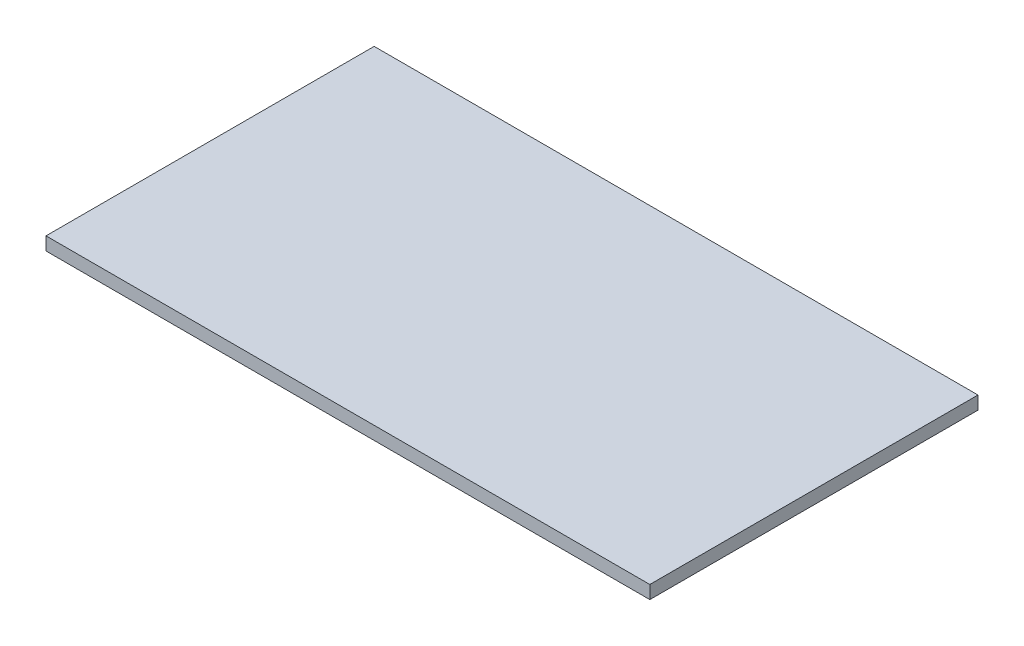
ISO-10303-21;
HEADER;
FILE_DESCRIPTION(('STEP AP214'),'2;1');
FILE_NAME('part.step','',(''),(''),'','','');
FILE_SCHEMA(('AUTOMOTIVE_DESIGN { 1 0 10303 214 1 1 1 1 }'));
ENDSEC;
DATA;
#1=APPLICATION_CONTEXT('core data for automotive mechanical design processes');
#2=APPLICATION_PROTOCOL_DEFINITION('international standard','automotive_design',2000,#1);
#3=PRODUCT_CONTEXT('',#1,'mechanical');
#4=PRODUCT('Part','Part','',(#3));
#5=PRODUCT_RELATED_PRODUCT_CATEGORY('part','',(#4));
#6=PRODUCT_DEFINITION_FORMATION('','',#4);
#7=PRODUCT_DEFINITION_CONTEXT('part definition',#1,'design');
#8=PRODUCT_DEFINITION('design','',#6,#7);
#9=PRODUCT_DEFINITION_SHAPE('','',#8);
#10=(LENGTH_UNIT() NAMED_UNIT(*) SI_UNIT(.MILLI.,.METRE.));
#11=(NAMED_UNIT(*) PLANE_ANGLE_UNIT() SI_UNIT($,.RADIAN.));
#12=(NAMED_UNIT(*) SI_UNIT($,.STERADIAN.) SOLID_ANGLE_UNIT());
#13=UNCERTAINTY_MEASURE_WITH_UNIT(LENGTH_MEASURE(1.E-05),#10,'distance_accuracy_value','');
#14=(GEOMETRIC_REPRESENTATION_CONTEXT(3) GLOBAL_UNCERTAINTY_ASSIGNED_CONTEXT((#13)) GLOBAL_UNIT_ASSIGNED_CONTEXT((#10,
#11,#12)) REPRESENTATION_CONTEXT('',''));
#15=CARTESIAN_POINT('',(0.,0.,0.));
#16=DIRECTION('',(0.,0.,1.));
#17=DIRECTION('',(1.,0.,0.));
#18=AXIS2_PLACEMENT_3D('',#15,#16,#17);
#19=CARTESIAN_POINT('',(-231.,158.,-126.));
#20=DIRECTION('',(1.,0.,0.));
#21=DIRECTION('',(0.,0.,-1.));
#22=AXIS2_PLACEMENT_3D('',#19,#20,#21);
#23=PLANE('',#22);
#24=DIRECTION('',(0.,0.,1.));
#25=VECTOR('',#24,1.);
#26=CARTESIAN_POINT('',(-231.,153.,-126.));
#27=LINE('',#26,#25);
#28=CARTESIAN_POINT('',(-231.,153.,-126.));
#29=VERTEX_POINT('',#28);
#30=CARTESIAN_POINT('',(-231.,153.,-0.99999999999989));
#31=VERTEX_POINT('',#30);
#32=EDGE_CURVE('E101',#29,#31,#27,.T.);
#33=ORIENTED_EDGE('',*,*,#32,.T.);
#34=DIRECTION('',(0.,-1.,0.));
#35=VECTOR('',#34,1.);
#36=CARTESIAN_POINT('',(-231.,158.,-0.99999999999989));
#37=LINE('',#36,#35);
#38=CARTESIAN_POINT('',(-231.,158.,-0.99999999999989));
#39=VERTEX_POINT('',#38);
#40=EDGE_CURVE('E11',#39,#31,#37,.T.);
#41=ORIENTED_EDGE('',*,*,#40,.F.);
#42=DIRECTION('',(0.,0.,1.));
#43=VECTOR('',#42,1.);
#44=CARTESIAN_POINT('',(-231.,158.,-126.));
#45=LINE('',#44,#43);
#46=CARTESIAN_POINT('',(-231.,158.,-126.));
#47=VERTEX_POINT('',#46);
#48=EDGE_CURVE('E89',#47,#39,#45,.T.);
#49=ORIENTED_EDGE('',*,*,#48,.F.);
#50=DIRECTION('',(0.,-1.,0.));
#51=VECTOR('',#50,1.);
#52=CARTESIAN_POINT('',(-231.,158.,-126.));
#53=LINE('',#52,#51);
#54=EDGE_CURVE('E97',#47,#29,#53,.T.);
#55=ORIENTED_EDGE('',*,*,#54,.T.);
#56=EDGE_LOOP('',(#33,#41,#49,#55));
#57=FACE_BOUND('',#56,.T.);
#58=ADVANCED_FACE('F38',(#57),#23,.F.);
#59=CARTESIAN_POINT('',(-231.,158.,-0.99999999999989));
#60=DIRECTION('',(0.,0.,-1.));
#61=DIRECTION('',(-1.,0.,0.));
#62=AXIS2_PLACEMENT_3D('',#59,#60,#61);
#63=PLANE('',#62);
#64=DIRECTION('',(1.,0.,0.));
#65=VECTOR('',#64,1.);
#66=CARTESIAN_POINT('',(-231.,153.,-0.99999999999989));
#67=LINE('',#66,#65);
#68=CARTESIAN_POINT('',(-1.,153.,-0.99999999999989));
#69=VERTEX_POINT('',#68);
#70=EDGE_CURVE('E93',#31,#69,#67,.T.);
#71=ORIENTED_EDGE('',*,*,#70,.T.);
#72=DIRECTION('',(0.,-1.,0.));
#73=VECTOR('',#72,1.);
#74=CARTESIAN_POINT('',(-1.,158.,-0.99999999999989));
#75=LINE('',#74,#73);
#76=CARTESIAN_POINT('',(-1.,158.,-0.99999999999989));
#77=VERTEX_POINT('',#76);
#78=EDGE_CURVE('E46',#77,#69,#75,.T.);
#79=ORIENTED_EDGE('',*,*,#78,.F.);
#80=DIRECTION('',(1.,0.,0.));
#81=VECTOR('',#80,1.);
#82=CARTESIAN_POINT('',(-231.,158.,-0.99999999999989));
#83=LINE('',#82,#81);
#84=EDGE_CURVE('E84',#39,#77,#83,.T.);
#85=ORIENTED_EDGE('',*,*,#84,.F.);
#86=ORIENTED_EDGE('',*,*,#40,.T.);
#87=EDGE_LOOP('',(#71,#79,#85,#86));
#88=FACE_BOUND('',#87,.T.);
#89=ADVANCED_FACE('F92',(#88),#63,.F.);
#90=CARTESIAN_POINT('',(-1.,158.,-126.));
#91=DIRECTION('',(-1.,0.,0.));
#92=DIRECTION('',(0.,0.,1.));
#93=AXIS2_PLACEMENT_3D('',#90,#91,#92);
#94=PLANE('',#93);
#95=DIRECTION('',(0.,0.,-1.));
#96=VECTOR('',#95,1.);
#97=CARTESIAN_POINT('',(-1.,153.,-126.));
#98=LINE('',#97,#96);
#99=CARTESIAN_POINT('',(-1.,153.,-126.));
#100=VERTEX_POINT('',#99);
#101=EDGE_CURVE('E71',#69,#100,#98,.T.);
#102=ORIENTED_EDGE('',*,*,#101,.T.);
#103=DIRECTION('',(0.,-1.,0.));
#104=VECTOR('',#103,1.);
#105=CARTESIAN_POINT('',(-1.,158.,-126.));
#106=LINE('',#105,#104);
#107=CARTESIAN_POINT('',(-1.,158.,-126.));
#108=VERTEX_POINT('',#107);
#109=EDGE_CURVE('E94',#108,#100,#106,.T.);
#110=ORIENTED_EDGE('',*,*,#109,.F.);
#111=DIRECTION('',(0.,0.,-1.));
#112=VECTOR('',#111,1.);
#113=CARTESIAN_POINT('',(-1.,158.,-126.));
#114=LINE('',#113,#112);
#115=EDGE_CURVE('E87',#77,#108,#114,.T.);
#116=ORIENTED_EDGE('',*,*,#115,.F.);
#117=ORIENTED_EDGE('',*,*,#78,.T.);
#118=EDGE_LOOP('',(#102,#110,#116,#117));
#119=FACE_BOUND('',#118,.T.);
#120=ADVANCED_FACE('F95',(#119),#94,.F.);
#121=CARTESIAN_POINT('',(-231.,158.,-126.));
#122=DIRECTION('',(0.,0.,1.));
#123=DIRECTION('',(1.,0.,0.));
#124=AXIS2_PLACEMENT_3D('',#121,#122,#123);
#125=PLANE('',#124);
#126=DIRECTION('',(-1.,0.,0.));
#127=VECTOR('',#126,1.);
#128=CARTESIAN_POINT('',(-231.,153.,-126.));
#129=LINE('',#128,#127);
#130=EDGE_CURVE('E77',#100,#29,#129,.T.);
#131=ORIENTED_EDGE('',*,*,#130,.T.);
#132=ORIENTED_EDGE('',*,*,#54,.F.);
#133=DIRECTION('',(-1.,0.,0.));
#134=VECTOR('',#133,1.);
#135=CARTESIAN_POINT('',(-231.,158.,-126.));
#136=LINE('',#135,#134);
#137=EDGE_CURVE('E54',#108,#47,#136,.T.);
#138=ORIENTED_EDGE('',*,*,#137,.F.);
#139=ORIENTED_EDGE('',*,*,#109,.T.);
#140=EDGE_LOOP('',(#131,#132,#138,#139));
#141=FACE_BOUND('',#140,.T.);
#142=ADVANCED_FACE('F108',(#141),#125,.F.);
#143=CARTESIAN_POINT('',(754.231317194732,158.,-128.020467364411));
#144=DIRECTION('',(0.,1.,0.));
#145=DIRECTION('',(0.,0.,1.));
#146=AXIS2_PLACEMENT_3D('',#143,#144,#145);
#147=PLANE('',#146);
#148=ORIENTED_EDGE('',*,*,#48,.T.);
#149=ORIENTED_EDGE('',*,*,#84,.T.);
#150=ORIENTED_EDGE('',*,*,#115,.T.);
#151=ORIENTED_EDGE('',*,*,#137,.T.);
#152=EDGE_LOOP('',(#148,#149,#150,#151));
#153=FACE_BOUND('',#152,.T.);
#154=ADVANCED_FACE('F85',(#153),#147,.T.);
#155=CARTESIAN_POINT('',(754.231317194732,153.,-128.020467364411));
#156=DIRECTION('',(0.,1.,0.));
#157=DIRECTION('',(0.,0.,1.));
#158=AXIS2_PLACEMENT_3D('',#155,#156,#157);
#159=PLANE('',#158);
#160=ORIENTED_EDGE('',*,*,#32,.F.);
#161=ORIENTED_EDGE('',*,*,#130,.F.);
#162=ORIENTED_EDGE('',*,*,#101,.F.);
#163=ORIENTED_EDGE('',*,*,#70,.F.);
#164=EDGE_LOOP('',(#160,#161,#162,#163));
#165=FACE_BOUND('',#164,.T.);
#166=ADVANCED_FACE('F111',(#165),#159,.F.);
#167=CLOSED_SHELL('',(#58,#89,#120,#142,#154,#166));
#168=MANIFOLD_SOLID_BREP('B2',#167);
#169=ADVANCED_BREP_SHAPE_REPRESENTATION('',(#18,#168),#14);
#170=SHAPE_DEFINITION_REPRESENTATION(#9,#169);
ENDSEC;
END-ISO-10303-21;
